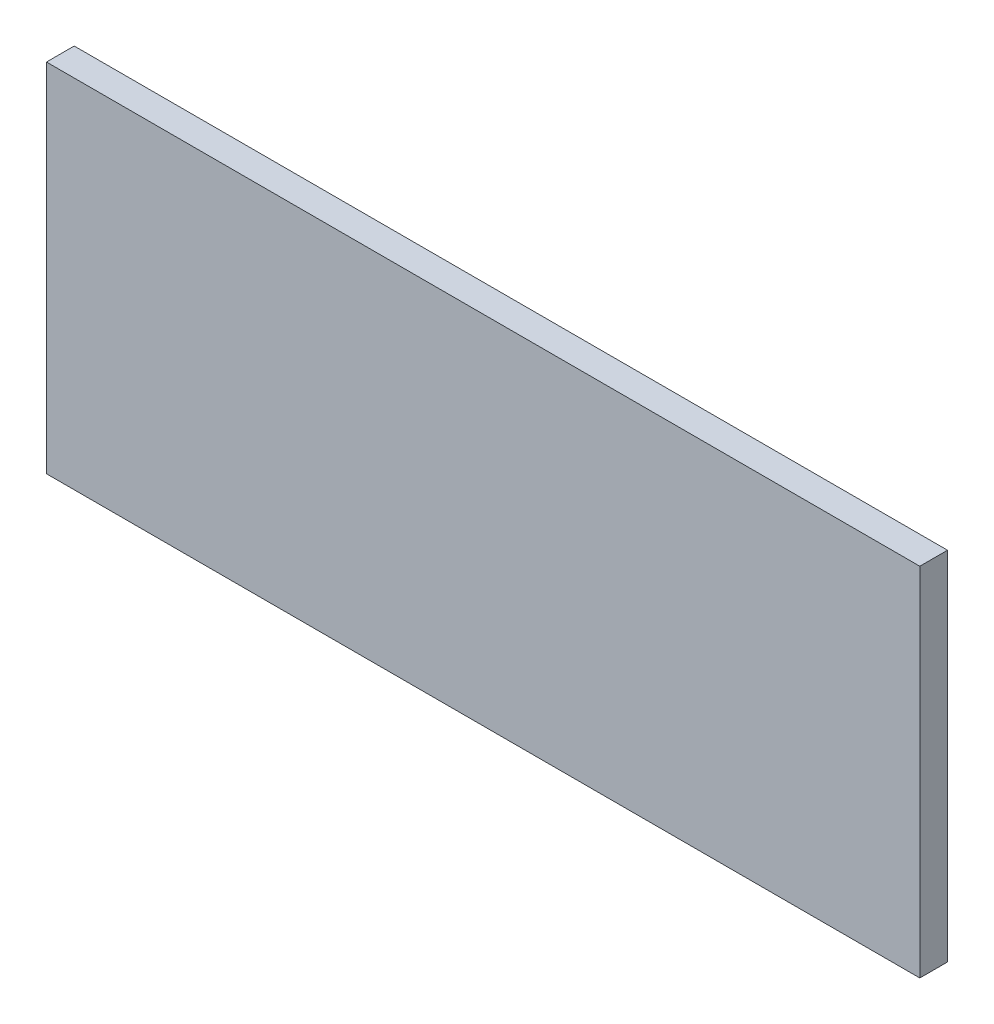
ISO-10303-21;
HEADER;
FILE_DESCRIPTION(('STEP AP214'),'2;1');
FILE_NAME('part.step','',(''),(''),'','','');
FILE_SCHEMA(('AUTOMOTIVE_DESIGN { 1 0 10303 214 1 1 1 1 }'));
ENDSEC;
DATA;
#1=APPLICATION_CONTEXT('core data for automotive mechanical design processes');
#2=APPLICATION_PROTOCOL_DEFINITION('international standard','automotive_design',2000,#1);
#3=PRODUCT_CONTEXT('',#1,'mechanical');
#4=PRODUCT('Part','Part','',(#3));
#5=PRODUCT_RELATED_PRODUCT_CATEGORY('part','',(#4));
#6=PRODUCT_DEFINITION_FORMATION('','',#4);
#7=PRODUCT_DEFINITION_CONTEXT('part definition',#1,'design');
#8=PRODUCT_DEFINITION('design','',#6,#7);
#9=PRODUCT_DEFINITION_SHAPE('','',#8);
#10=(LENGTH_UNIT() NAMED_UNIT(*) SI_UNIT(.MILLI.,.METRE.));
#11=(NAMED_UNIT(*) PLANE_ANGLE_UNIT() SI_UNIT($,.RADIAN.));
#12=(NAMED_UNIT(*) SI_UNIT($,.STERADIAN.) SOLID_ANGLE_UNIT());
#13=UNCERTAINTY_MEASURE_WITH_UNIT(LENGTH_MEASURE(1.E-05),#10,'distance_accuracy_value','');
#14=(GEOMETRIC_REPRESENTATION_CONTEXT(3) GLOBAL_UNCERTAINTY_ASSIGNED_CONTEXT((#13)) GLOBAL_UNIT_ASSIGNED_CONTEXT((#10,
#11,#12)) REPRESENTATION_CONTEXT('',''));
#15=CARTESIAN_POINT('',(0.,0.,0.));
#16=DIRECTION('',(0.,0.,1.));
#17=DIRECTION('',(1.,0.,0.));
#18=AXIS2_PLACEMENT_3D('',#15,#16,#17);
#19=CARTESIAN_POINT('',(300.,5.0000000000001,19.05));
#20=DIRECTION('',(-1.,0.,0.));
#21=DIRECTION('',(0.,0.,1.));
#22=AXIS2_PLACEMENT_3D('',#19,#20,#21);
#23=PLANE('',#22);
#24=DIRECTION('',(0.,1.,0.));
#25=VECTOR('',#24,1.);
#26=CARTESIAN_POINT('',(300.,5.0000000000001,0.));
#27=LINE('',#26,#25);
#28=CARTESIAN_POINT('',(300.,5.0000000000001,0.));
#29=VERTEX_POINT('',#28);
#30=CARTESIAN_POINT('',(300.,250.,0.));
#31=VERTEX_POINT('',#30);
#32=EDGE_CURVE('E97',#29,#31,#27,.T.);
#33=ORIENTED_EDGE('',*,*,#32,.T.);
#34=DIRECTION('',(0.,0.,-1.));
#35=VECTOR('',#34,1.);
#36=CARTESIAN_POINT('',(300.,250.,19.05));
#37=LINE('',#36,#35);
#38=CARTESIAN_POINT('',(300.,250.,19.05));
#39=VERTEX_POINT('',#38);
#40=EDGE_CURVE('E11',#39,#31,#37,.T.);
#41=ORIENTED_EDGE('',*,*,#40,.F.);
#42=DIRECTION('',(0.,1.,0.));
#43=VECTOR('',#42,1.);
#44=CARTESIAN_POINT('',(300.,5.0000000000001,19.05));
#45=LINE('',#44,#43);
#46=CARTESIAN_POINT('',(300.,5.0000000000001,19.05));
#47=VERTEX_POINT('',#46);
#48=EDGE_CURVE('E85',#47,#39,#45,.T.);
#49=ORIENTED_EDGE('',*,*,#48,.F.);
#50=DIRECTION('',(0.,0.,-1.));
#51=VECTOR('',#50,1.);
#52=CARTESIAN_POINT('',(300.,5.0000000000001,19.05));
#53=LINE('',#52,#51);
#54=EDGE_CURVE('E93',#47,#29,#53,.T.);
#55=ORIENTED_EDGE('',*,*,#54,.T.);
#56=EDGE_LOOP('',(#33,#41,#49,#55));
#57=FACE_BOUND('',#56,.T.);
#58=ADVANCED_FACE('F34',(#57),#23,.F.);
#59=CARTESIAN_POINT('',(300.,250.,19.05));
#60=DIRECTION('',(0.,-1.,0.));
#61=DIRECTION('',(0.,0.,-1.));
#62=AXIS2_PLACEMENT_3D('',#59,#60,#61);
#63=PLANE('',#62);
#64=DIRECTION('',(-1.,0.,0.));
#65=VECTOR('',#64,1.);
#66=CARTESIAN_POINT('',(300.,250.,0.));
#67=LINE('',#66,#65);
#68=CARTESIAN_POINT('',(-300.,250.,0.));
#69=VERTEX_POINT('',#68);
#70=EDGE_CURVE('E89',#31,#69,#67,.T.);
#71=ORIENTED_EDGE('',*,*,#70,.T.);
#72=DIRECTION('',(0.,0.,-1.));
#73=VECTOR('',#72,1.);
#74=CARTESIAN_POINT('',(-300.,250.,19.05));
#75=LINE('',#74,#73);
#76=CARTESIAN_POINT('',(-300.,250.,19.05));
#77=VERTEX_POINT('',#76);
#78=EDGE_CURVE('E42',#77,#69,#75,.T.);
#79=ORIENTED_EDGE('',*,*,#78,.F.);
#80=DIRECTION('',(-1.,0.,0.));
#81=VECTOR('',#80,1.);
#82=CARTESIAN_POINT('',(300.,250.,19.05));
#83=LINE('',#82,#81);
#84=EDGE_CURVE('E80',#39,#77,#83,.T.);
#85=ORIENTED_EDGE('',*,*,#84,.F.);
#86=ORIENTED_EDGE('',*,*,#40,.T.);
#87=EDGE_LOOP('',(#71,#79,#85,#86));
#88=FACE_BOUND('',#87,.T.);
#89=ADVANCED_FACE('F88',(#88),#63,.F.);
#90=CARTESIAN_POINT('',(-300.,5.0000000000001,19.05));
#91=DIRECTION('',(1.,0.,0.));
#92=DIRECTION('',(0.,0.,-1.));
#93=AXIS2_PLACEMENT_3D('',#90,#91,#92);
#94=PLANE('',#93);
#95=DIRECTION('',(0.,-1.,0.));
#96=VECTOR('',#95,1.);
#97=CARTESIAN_POINT('',(-300.,5.0000000000001,0.));
#98=LINE('',#97,#96);
#99=CARTESIAN_POINT('',(-300.,5.0000000000001,0.));
#100=VERTEX_POINT('',#99);
#101=EDGE_CURVE('E67',#69,#100,#98,.T.);
#102=ORIENTED_EDGE('',*,*,#101,.T.);
#103=DIRECTION('',(0.,0.,-1.));
#104=VECTOR('',#103,1.);
#105=CARTESIAN_POINT('',(-300.,5.0000000000001,19.05));
#106=LINE('',#105,#104);
#107=CARTESIAN_POINT('',(-300.,5.0000000000001,19.05));
#108=VERTEX_POINT('',#107);
#109=EDGE_CURVE('E90',#108,#100,#106,.T.);
#110=ORIENTED_EDGE('',*,*,#109,.F.);
#111=DIRECTION('',(0.,-1.,0.));
#112=VECTOR('',#111,1.);
#113=CARTESIAN_POINT('',(-300.,5.0000000000001,19.05));
#114=LINE('',#113,#112);
#115=EDGE_CURVE('E83',#77,#108,#114,.T.);
#116=ORIENTED_EDGE('',*,*,#115,.F.);
#117=ORIENTED_EDGE('',*,*,#78,.T.);
#118=EDGE_LOOP('',(#102,#110,#116,#117));
#119=FACE_BOUND('',#118,.T.);
#120=ADVANCED_FACE('F91',(#119),#94,.F.);
#121=CARTESIAN_POINT('',(300.,5.0000000000001,19.05));
#122=DIRECTION('',(0.,1.,0.));
#123=DIRECTION('',(0.,0.,1.));
#124=AXIS2_PLACEMENT_3D('',#121,#122,#123);
#125=PLANE('',#124);
#126=DIRECTION('',(1.,0.,0.));
#127=VECTOR('',#126,1.);
#128=CARTESIAN_POINT('',(300.,5.0000000000001,0.));
#129=LINE('',#128,#127);
#130=EDGE_CURVE('E73',#100,#29,#129,.T.);
#131=ORIENTED_EDGE('',*,*,#130,.T.);
#132=ORIENTED_EDGE('',*,*,#54,.F.);
#133=DIRECTION('',(1.,0.,0.));
#134=VECTOR('',#133,1.);
#135=CARTESIAN_POINT('',(300.,5.0000000000001,19.05));
#136=LINE('',#135,#134);
#137=EDGE_CURVE('E50',#108,#47,#136,.T.);
#138=ORIENTED_EDGE('',*,*,#137,.F.);
#139=ORIENTED_EDGE('',*,*,#109,.T.);
#140=EDGE_LOOP('',(#131,#132,#138,#139));
#141=FACE_BOUND('',#140,.T.);
#142=ADVANCED_FACE('F104',(#141),#125,.F.);
#143=CARTESIAN_POINT('',(0.,0.,19.05));
#144=DIRECTION('',(0.,0.,1.));
#145=DIRECTION('',(1.,0.,0.));
#146=AXIS2_PLACEMENT_3D('',#143,#144,#145);
#147=PLANE('',#146);
#148=ORIENTED_EDGE('',*,*,#48,.T.);
#149=ORIENTED_EDGE('',*,*,#84,.T.);
#150=ORIENTED_EDGE('',*,*,#115,.T.);
#151=ORIENTED_EDGE('',*,*,#137,.T.);
#152=EDGE_LOOP('',(#148,#149,#150,#151));
#153=FACE_BOUND('',#152,.T.);
#154=ADVANCED_FACE('F81',(#153),#147,.T.);
#155=CARTESIAN_POINT('',(0.,0.,0.));
#156=DIRECTION('',(0.,0.,1.));
#157=DIRECTION('',(1.,0.,0.));
#158=AXIS2_PLACEMENT_3D('',#155,#156,#157);
#159=PLANE('',#158);
#160=ORIENTED_EDGE('',*,*,#32,.F.);
#161=ORIENTED_EDGE('',*,*,#130,.F.);
#162=ORIENTED_EDGE('',*,*,#101,.F.);
#163=ORIENTED_EDGE('',*,*,#70,.F.);
#164=EDGE_LOOP('',(#160,#161,#162,#163));
#165=FACE_BOUND('',#164,.T.);
#166=ADVANCED_FACE('F107',(#165),#159,.F.);
#167=CLOSED_SHELL('',(#58,#89,#120,#142,#154,#166));
#168=MANIFOLD_SOLID_BREP('B2',#167);
#169=ADVANCED_BREP_SHAPE_REPRESENTATION('',(#18,#168),#14);
#170=SHAPE_DEFINITION_REPRESENTATION(#9,#169);
ENDSEC;
END-ISO-10303-21;
